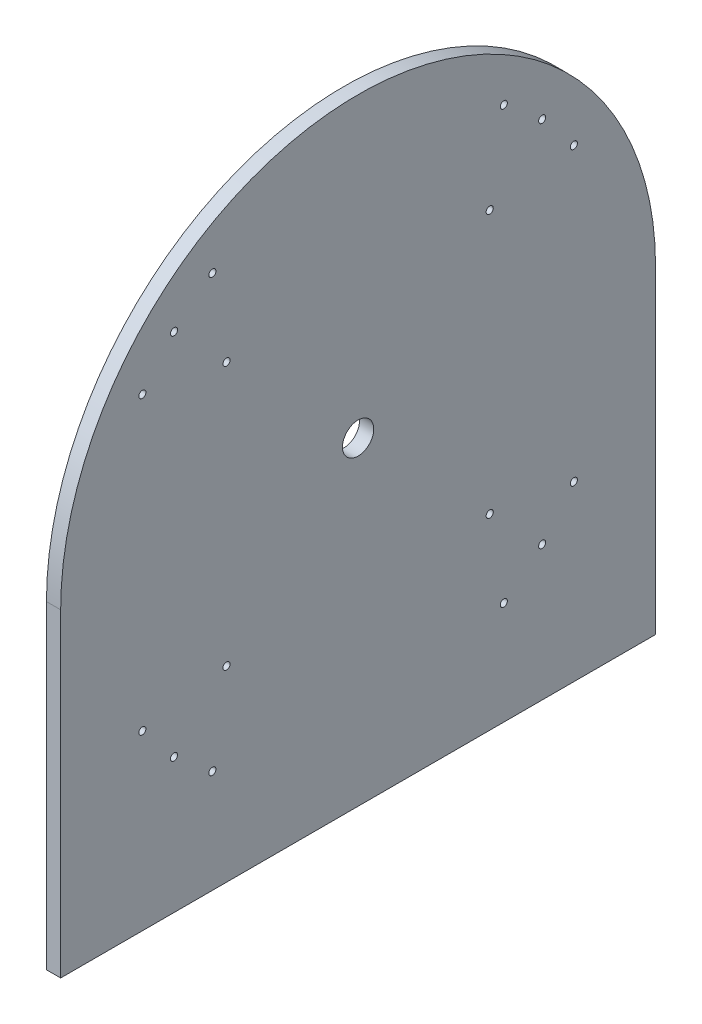
ISO-10303-21;
HEADER;
FILE_DESCRIPTION(('STEP AP214'),'2;1');
FILE_NAME('part.step','',(''),(''),'','','');
FILE_SCHEMA(('AUTOMOTIVE_DESIGN { 1 0 10303 214 1 1 1 1 }'));
ENDSEC;
DATA;
#1=APPLICATION_CONTEXT('core data for automotive mechanical design processes');
#2=APPLICATION_PROTOCOL_DEFINITION('international standard','automotive_design',2000,#1);
#3=PRODUCT_CONTEXT('',#1,'mechanical');
#4=PRODUCT('Part','Part','',(#3));
#5=PRODUCT_RELATED_PRODUCT_CATEGORY('part','',(#4));
#6=PRODUCT_DEFINITION_FORMATION('','',#4);
#7=PRODUCT_DEFINITION_CONTEXT('part definition',#1,'design');
#8=PRODUCT_DEFINITION('design','',#6,#7);
#9=PRODUCT_DEFINITION_SHAPE('','',#8);
#10=(LENGTH_UNIT() NAMED_UNIT(*) SI_UNIT(.MILLI.,.METRE.));
#11=(NAMED_UNIT(*) PLANE_ANGLE_UNIT() SI_UNIT($,.RADIAN.));
#12=(NAMED_UNIT(*) SI_UNIT($,.STERADIAN.) SOLID_ANGLE_UNIT());
#13=UNCERTAINTY_MEASURE_WITH_UNIT(LENGTH_MEASURE(1.E-05),#10,'distance_accuracy_value','');
#14=(GEOMETRIC_REPRESENTATION_CONTEXT(3) GLOBAL_UNCERTAINTY_ASSIGNED_CONTEXT((#13)) GLOBAL_UNIT_ASSIGNED_CONTEXT((#10,
#11,#12)) REPRESENTATION_CONTEXT('',''));
#15=CARTESIAN_POINT('',(0.,0.,0.));
#16=DIRECTION('',(0.,0.,1.));
#17=DIRECTION('',(1.,0.,0.));
#18=AXIS2_PLACEMENT_3D('',#15,#16,#17);
#19=CARTESIAN_POINT('',(10.,0.,0.));
#20=DIRECTION('',(-1.,0.,0.));
#21=DIRECTION('',(0.,0.,1.));
#22=AXIS2_PLACEMENT_3D('',#19,#20,#21);
#23=CYLINDRICAL_SURFACE('',#22,209.31);
#24=CARTESIAN_POINT('',(0.,0.,0.));
#25=DIRECTION('',(1.,0.,0.));
#26=DIRECTION('',(0.,0.,-1.));
#27=AXIS2_PLACEMENT_3D('',#24,#25,#26);
#28=CIRCLE('',#27,209.31);
#29=CARTESIAN_POINT('',(0.,0.,-209.31));
#30=VERTEX_POINT('',#29);
#31=CARTESIAN_POINT('',(0.,0.,209.31));
#32=VERTEX_POINT('',#31);
#33=EDGE_CURVE('E108',#30,#32,#28,.T.);
#34=ORIENTED_EDGE('',*,*,#33,.T.);
#35=DIRECTION('',(-1.,0.,0.));
#36=VECTOR('',#35,1.);
#37=CARTESIAN_POINT('',(10.,0.,209.31));
#38=LINE('',#37,#36);
#39=CARTESIAN_POINT('',(10.,0.,209.31));
#40=VERTEX_POINT('',#39);
#41=EDGE_CURVE('E11',#40,#32,#38,.T.);
#42=ORIENTED_EDGE('',*,*,#41,.F.);
#43=CARTESIAN_POINT('',(10.,0.,0.));
#44=DIRECTION('',(1.,0.,0.));
#45=DIRECTION('',(0.,0.,-1.));
#46=AXIS2_PLACEMENT_3D('',#43,#44,#45);
#47=CIRCLE('',#46,209.31);
#48=CARTESIAN_POINT('',(10.,0.,-209.31));
#49=VERTEX_POINT('',#48);
#50=EDGE_CURVE('E81',#49,#40,#47,.T.);
#51=ORIENTED_EDGE('',*,*,#50,.F.);
#52=DIRECTION('',(-1.,0.,0.));
#53=VECTOR('',#52,1.);
#54=CARTESIAN_POINT('',(10.,0.,-209.31));
#55=LINE('',#54,#53);
#56=EDGE_CURVE('E104',#49,#30,#55,.T.);
#57=ORIENTED_EDGE('',*,*,#56,.T.);
#58=EDGE_LOOP('',(#34,#42,#51,#57));
#59=FACE_BOUND('',#58,.T.);
#60=ADVANCED_FACE('F41',(#59),#23,.T.);
#61=CARTESIAN_POINT('',(10.,0.,209.31));
#62=DIRECTION('',(0.,0.,1.));
#63=DIRECTION('',(0.,-1.,0.));
#64=AXIS2_PLACEMENT_3D('',#61,#62,#63);
#65=PLANE('',#64);
#66=DIRECTION('',(0.,1.,0.));
#67=VECTOR('',#66,1.);
#68=CARTESIAN_POINT('',(0.,0.,209.31));
#69=LINE('',#68,#67);
#70=CARTESIAN_POINT('',(0.,-224.4,209.31));
#71=VERTEX_POINT('',#70);
#72=EDGE_CURVE('E90',#71,#32,#69,.T.);
#73=ORIENTED_EDGE('',*,*,#72,.F.);
#74=DIRECTION('',(-1.,0.,0.));
#75=VECTOR('',#74,1.);
#76=CARTESIAN_POINT('',(10.,-224.4,209.31));
#77=LINE('',#76,#75);
#78=CARTESIAN_POINT('',(10.,-224.4,209.31));
#79=VERTEX_POINT('',#78);
#80=EDGE_CURVE('E50',#79,#71,#77,.T.);
#81=ORIENTED_EDGE('',*,*,#80,.F.);
#82=DIRECTION('',(0.,1.,0.));
#83=VECTOR('',#82,1.);
#84=CARTESIAN_POINT('',(10.,0.,209.31));
#85=LINE('',#84,#83);
#86=EDGE_CURVE('E88',#79,#40,#85,.T.);
#87=ORIENTED_EDGE('',*,*,#86,.T.);
#88=ORIENTED_EDGE('',*,*,#41,.T.);
#89=EDGE_LOOP('',(#73,#81,#87,#88));
#90=FACE_BOUND('',#89,.T.);
#91=ADVANCED_FACE('F87',(#90),#65,.T.);
#92=CARTESIAN_POINT('',(10.,-224.4,0.));
#93=DIRECTION('',(0.,-1.,0.));
#94=DIRECTION('',(0.,0.,-1.));
#95=AXIS2_PLACEMENT_3D('',#92,#93,#94);
#96=PLANE('',#95);
#97=DIRECTION('',(0.,0.,1.));
#98=VECTOR('',#97,1.);
#99=CARTESIAN_POINT('',(0.,-224.4,0.));
#100=LINE('',#99,#98);
#101=CARTESIAN_POINT('',(0.,-224.4,-209.31));
#102=VERTEX_POINT('',#101);
#103=EDGE_CURVE('E115',#102,#71,#100,.T.);
#104=ORIENTED_EDGE('',*,*,#103,.F.);
#105=DIRECTION('',(-1.,0.,0.));
#106=VECTOR('',#105,1.);
#107=CARTESIAN_POINT('',(10.,-224.4,-209.31));
#108=LINE('',#107,#106);
#109=CARTESIAN_POINT('',(10.,-224.4,-209.31));
#110=VERTEX_POINT('',#109);
#111=EDGE_CURVE('E73',#110,#102,#108,.T.);
#112=ORIENTED_EDGE('',*,*,#111,.F.);
#113=DIRECTION('',(0.,0.,1.));
#114=VECTOR('',#113,1.);
#115=CARTESIAN_POINT('',(10.,-224.4,0.));
#116=LINE('',#115,#114);
#117=EDGE_CURVE('E97',#110,#79,#116,.T.);
#118=ORIENTED_EDGE('',*,*,#117,.T.);
#119=ORIENTED_EDGE('',*,*,#80,.T.);
#120=EDGE_LOOP('',(#104,#112,#118,#119));
#121=FACE_BOUND('',#120,.T.);
#122=ADVANCED_FACE('F100',(#121),#96,.T.);
#123=CARTESIAN_POINT('',(10.,0.,-209.31));
#124=DIRECTION('',(0.,0.,1.));
#125=DIRECTION('',(1.,0.,0.));
#126=AXIS2_PLACEMENT_3D('',#123,#124,#125);
#127=PLANE('',#126);
#128=DIRECTION('',(0.,1.,0.));
#129=VECTOR('',#128,1.);
#130=CARTESIAN_POINT('',(0.,0.,-209.31));
#131=LINE('',#130,#129);
#132=EDGE_CURVE('E76',#102,#30,#131,.T.);
#133=ORIENTED_EDGE('',*,*,#132,.T.);
#134=ORIENTED_EDGE('',*,*,#56,.F.);
#135=DIRECTION('',(0.,1.,0.));
#136=VECTOR('',#135,1.);
#137=CARTESIAN_POINT('',(10.,0.,-209.31));
#138=LINE('',#137,#136);
#139=EDGE_CURVE('E58',#110,#49,#138,.T.);
#140=ORIENTED_EDGE('',*,*,#139,.F.);
#141=ORIENTED_EDGE('',*,*,#111,.T.);
#142=EDGE_LOOP('',(#133,#134,#140,#141));
#143=FACE_BOUND('',#142,.T.);
#144=ADVANCED_FACE('F138',(#143),#127,.F.);
#145=CARTESIAN_POINT('',(10.,0.,0.));
#146=DIRECTION('',(1.,0.,0.));
#147=DIRECTION('',(0.,0.,-1.));
#148=AXIS2_PLACEMENT_3D('',#145,#146,#147);
#149=PLANE('',#148);
#150=CARTESIAN_POINT('',(10.,151.806215461655,102.535111289771));
#151=DIRECTION('',(1.,0.,0.));
#152=DIRECTION('',(0.,0.,1.));
#153=AXIS2_PLACEMENT_3D('',#150,#151,#152);
#154=CIRCLE('',#153,2.49999999999999);
#155=CARTESIAN_POINT('',(10.,151.806215461655,105.035111289771));
#156=VERTEX_POINT('',#155);
#157=EDGE_CURVE('E405',#156,#156,#154,.T.);
#158=ORIENTED_EDGE('',*,*,#157,.F.);
#159=EDGE_LOOP('',(#158));
#160=FACE_BOUND('',#159,.T.);
#161=CARTESIAN_POINT('',(10.,151.806215461681,-102.535111289757));
#162=DIRECTION('',(1.,0.,0.));
#163=DIRECTION('',(0.,0.,-1.));
#164=AXIS2_PLACEMENT_3D('',#161,#162,#163);
#165=CIRCLE('',#164,2.5000000000151);
#166=CARTESIAN_POINT('',(10.,151.806215461681,-105.035111289772));
#167=VERTEX_POINT('',#166);
#168=EDGE_CURVE('E397',#167,#167,#165,.T.);
#169=ORIENTED_EDGE('',*,*,#168,.F.);
#170=EDGE_LOOP('',(#169));
#171=FACE_BOUND('',#170,.T.);
#172=CARTESIAN_POINT('',(10.,102.535111289788,-151.806215461655));
#173=DIRECTION('',(1.,0.,0.));
#174=DIRECTION('',(0.,0.,1.));
#175=AXIS2_PLACEMENT_3D('',#172,#173,#174);
#176=CIRCLE('',#175,2.49999999999417);
#177=CARTESIAN_POINT('',(10.,102.535111289788,-149.306215461661));
#178=VERTEX_POINT('',#177);
#179=EDGE_CURVE('E389',#178,#178,#176,.T.);
#180=ORIENTED_EDGE('',*,*,#179,.F.);
#181=EDGE_LOOP('',(#180));
#182=FACE_BOUND('',#181,.T.);
#183=CARTESIAN_POINT('',(10.,-102.535111289742,-151.806215461678));
#184=DIRECTION('',(1.,0.,0.));
#185=DIRECTION('',(0.,0.,-1.));
#186=AXIS2_PLACEMENT_3D('',#183,#184,#185);
#187=CIRCLE('',#186,2.50000000001716);
#188=CARTESIAN_POINT('',(10.,-102.535111289742,-154.306215461696));
#189=VERTEX_POINT('',#188);
#190=EDGE_CURVE('E380',#189,#189,#187,.T.);
#191=ORIENTED_EDGE('',*,*,#190,.F.);
#192=EDGE_LOOP('',(#191));
#193=FACE_BOUND('',#192,.T.);
#194=CARTESIAN_POINT('',(10.,-151.80621546164,-102.535111289785));
#195=DIRECTION('',(1.,0.,0.));
#196=DIRECTION('',(0.,0.,1.));
#197=AXIS2_PLACEMENT_3D('',#194,#195,#196);
#198=CIRCLE('',#197,2.4999999999807);
#199=CARTESIAN_POINT('',(10.,-151.80621546164,-100.035111289804));
#200=VERTEX_POINT('',#199);
#201=EDGE_CURVE('E427',#200,#200,#198,.T.);
#202=ORIENTED_EDGE('',*,*,#201,.F.);
#203=EDGE_LOOP('',(#202));
#204=FACE_BOUND('',#203,.T.);
#205=CARTESIAN_POINT('',(10.,-151.806215461664,102.535111289745));
#206=DIRECTION('',(1.,0.,0.));
#207=DIRECTION('',(0.,0.,-1.));
#208=AXIS2_PLACEMENT_3D('',#205,#206,#207);
#209=CIRCLE('',#208,2.50000000000312);
#210=CARTESIAN_POINT('',(10.,-151.806215461664,100.035111289742));
#211=VERTEX_POINT('',#210);
#212=EDGE_CURVE('E419',#211,#211,#209,.T.);
#213=ORIENTED_EDGE('',*,*,#212,.F.);
#214=EDGE_LOOP('',(#213));
#215=FACE_BOUND('',#214,.T.);
#216=CARTESIAN_POINT('',(10.,-102.53511128977,151.806215461643));
#217=DIRECTION('',(1.,0.,0.));
#218=DIRECTION('',(0.,0.,1.));
#219=AXIS2_PLACEMENT_3D('',#216,#217,#218);
#220=CIRCLE('',#219,2.49999999998698);
#221=CARTESIAN_POINT('',(10.,-102.53511128977,154.30621546163));
#222=VERTEX_POINT('',#221);
#223=EDGE_CURVE('E411',#222,#222,#220,.T.);
#224=ORIENTED_EDGE('',*,*,#223,.F.);
#225=EDGE_LOOP('',(#224));
#226=FACE_BOUND('',#225,.T.);
#227=CARTESIAN_POINT('',(10.,102.535111289759,151.806215461667));
#228=DIRECTION('',(1.,0.,0.));
#229=DIRECTION('',(0.,0.,-1.));
#230=AXIS2_PLACEMENT_3D('',#227,#228,#229);
#231=CIRCLE('',#230,2.5);
#232=CARTESIAN_POINT('',(10.,102.535111289759,149.306215461667));
#233=VERTEX_POINT('',#232);
#234=EDGE_CURVE('E372',#233,#233,#231,.T.);
#235=ORIENTED_EDGE('',*,*,#234,.F.);
#236=EDGE_LOOP('',(#235));
#237=FACE_BOUND('',#236,.T.);
#238=CARTESIAN_POINT('',(10.,0.,0.));
#239=DIRECTION('',(1.,0.,0.));
#240=DIRECTION('',(0.,0.,-1.));
#241=AXIS2_PLACEMENT_3D('',#238,#239,#240);
#242=CIRCLE('',#241,11.);
#243=CARTESIAN_POINT('',(10.,0.,-11.));
#244=VERTEX_POINT('',#243);
#245=EDGE_CURVE('E364',#244,#244,#242,.T.);
#246=ORIENTED_EDGE('',*,*,#245,.F.);
#247=EDGE_LOOP('',(#246));
#248=FACE_BOUND('',#247,.T.);
#249=CARTESIAN_POINT('',(10.,-92.6097751320016,-92.6097751320129));
#250=DIRECTION('',(1.,0.,0.));
#251=DIRECTION('',(0.,0.,-1.));
#252=AXIS2_PLACEMENT_3D('',#249,#250,#251);
#253=CIRCLE('',#252,2.49999999999715);
#254=CARTESIAN_POINT('',(10.,-92.6097751320016,-95.1097751320101));
#255=VERTEX_POINT('',#254);
#256=EDGE_CURVE('E318',#255,#255,#253,.T.);
#257=ORIENTED_EDGE('',*,*,#256,.F.);
#258=EDGE_LOOP('',(#257));
#259=FACE_BOUND('',#258,.T.);
#260=CARTESIAN_POINT('',(10.,92.6097751320026,-92.6097751320016));
#261=DIRECTION('',(1.,0.,0.));
#262=DIRECTION('',(0.,0.,-1.));
#263=AXIS2_PLACEMENT_3D('',#260,#261,#262);
#264=CIRCLE('',#263,2.5);
#265=CARTESIAN_POINT('',(10.,92.6097751320026,-95.1097751320016));
#266=VERTEX_POINT('',#265);
#267=EDGE_CURVE('E327',#266,#266,#264,.T.);
#268=ORIENTED_EDGE('',*,*,#267,.F.);
#269=EDGE_LOOP('',(#268));
#270=FACE_BOUND('',#269,.T.);
#271=CARTESIAN_POINT('',(10.,129.534891245564,-129.534891245563));
#272=DIRECTION('',(1.,0.,0.));
#273=DIRECTION('',(0.,0.,-1.));
#274=AXIS2_PLACEMENT_3D('',#271,#272,#273);
#275=CIRCLE('',#274,2.5);
#276=CARTESIAN_POINT('',(10.,129.534891245564,-132.034891245563));
#277=VERTEX_POINT('',#276);
#278=EDGE_CURVE('E306',#277,#277,#275,.T.);
#279=ORIENTED_EDGE('',*,*,#278,.F.);
#280=EDGE_LOOP('',(#279));
#281=FACE_BOUND('',#280,.T.);
#282=CARTESIAN_POINT('',(10.,129.534891245553,129.534891245564));
#283=DIRECTION('',(1.,0.,0.));
#284=DIRECTION('',(0.,0.,-1.));
#285=AXIS2_PLACEMENT_3D('',#282,#283,#284);
#286=CIRCLE('',#285,2.50000000001075);
#287=CARTESIAN_POINT('',(10.,129.534891245553,127.034891245554));
#288=VERTEX_POINT('',#287);
#289=EDGE_CURVE('E298',#288,#288,#286,.T.);
#290=ORIENTED_EDGE('',*,*,#289,.F.);
#291=EDGE_LOOP('',(#290));
#292=FACE_BOUND('',#291,.T.);
#293=CARTESIAN_POINT('',(10.,92.6097751319913,92.6097751320027));
#294=DIRECTION('',(1.,0.,0.));
#295=DIRECTION('',(0.,0.,-1.));
#296=AXIS2_PLACEMENT_3D('',#293,#294,#295);
#297=CIRCLE('',#296,2.50000000001048);
#298=CARTESIAN_POINT('',(10.,92.6097751319913,90.1097751319922));
#299=VERTEX_POINT('',#298);
#300=EDGE_CURVE('E308',#299,#299,#297,.T.);
#301=ORIENTED_EDGE('',*,*,#300,.F.);
#302=EDGE_LOOP('',(#301));
#303=FACE_BOUND('',#302,.T.);
#304=CARTESIAN_POINT('',(10.,-129.534891245575,129.534891245553));
#305=DIRECTION('',(1.,0.,0.));
#306=DIRECTION('',(0.,0.,-1.));
#307=AXIS2_PLACEMENT_3D('',#304,#305,#306);
#308=CIRCLE('',#307,2.50000000000739);
#309=CARTESIAN_POINT('',(10.,-129.534891245575,127.034891245545));
#310=VERTEX_POINT('',#309);
#311=EDGE_CURVE('E353',#310,#310,#308,.T.);
#312=ORIENTED_EDGE('',*,*,#311,.F.);
#313=EDGE_LOOP('',(#312));
#314=FACE_BOUND('',#313,.T.);
#315=CARTESIAN_POINT('',(10.,-129.534891245563,-129.534891245575));
#316=DIRECTION('',(1.,0.,0.));
#317=DIRECTION('',(0.,0.,-1.));
#318=AXIS2_PLACEMENT_3D('',#315,#316,#317);
#319=CIRCLE('',#318,2.49999999999725);
#320=CARTESIAN_POINT('',(10.,-129.534891245563,-132.034891245572));
#321=VERTEX_POINT('',#320);
#322=EDGE_CURVE('E344',#321,#321,#319,.T.);
#323=ORIENTED_EDGE('',*,*,#322,.F.);
#324=EDGE_LOOP('',(#323));
#325=FACE_BOUND('',#324,.T.);
#326=CARTESIAN_POINT('',(10.,-92.609775132013,92.6097751319913));
#327=DIRECTION('',(1.,0.,0.));
#328=DIRECTION('',(0.,0.,-1.));
#329=AXIS2_PLACEMENT_3D('',#326,#327,#328);
#330=CIRCLE('',#329,2.5000000000072);
#331=CARTESIAN_POINT('',(10.,-92.609775132013,90.1097751319841));
#332=VERTEX_POINT('',#331);
#333=EDGE_CURVE('E315',#332,#332,#330,.T.);
#334=ORIENTED_EDGE('',*,*,#333,.F.);
#335=EDGE_LOOP('',(#334));
#336=FACE_BOUND('',#335,.T.);
#337=ORIENTED_EDGE('',*,*,#50,.T.);
#338=ORIENTED_EDGE('',*,*,#86,.F.);
#339=ORIENTED_EDGE('',*,*,#117,.F.);
#340=ORIENTED_EDGE('',*,*,#139,.T.);
#341=EDGE_LOOP('',(#337,#338,#339,#340));
#342=FACE_BOUND('',#341,.T.);
#343=ADVANCED_FACE('F96',(#160,#171,#182,#193,#204,#215,#226,#237,#248,#259,#270,#281,#292,#303,
#314,#325,#336,#342),#149,.T.);
#344=CARTESIAN_POINT('',(0.,0.,0.));
#345=DIRECTION('',(1.,0.,0.));
#346=DIRECTION('',(0.,0.,-1.));
#347=AXIS2_PLACEMENT_3D('',#344,#345,#346);
#348=PLANE('',#347);
#349=CARTESIAN_POINT('',(0.,151.806215461655,102.535111289771));
#350=DIRECTION('',(1.,0.,0.));
#351=DIRECTION('',(0.,0.,1.));
#352=AXIS2_PLACEMENT_3D('',#349,#350,#351);
#353=CIRCLE('',#352,2.49999999999999);
#354=CARTESIAN_POINT('',(0.,151.806215461655,105.035111289771));
#355=VERTEX_POINT('',#354);
#356=EDGE_CURVE('E376',#355,#355,#353,.T.);
#357=ORIENTED_EDGE('',*,*,#356,.T.);
#358=EDGE_LOOP('',(#357));
#359=FACE_BOUND('',#358,.T.);
#360=CARTESIAN_POINT('',(0.,151.806215461681,-102.535111289757));
#361=DIRECTION('',(1.,0.,0.));
#362=DIRECTION('',(0.,0.,-1.));
#363=AXIS2_PLACEMENT_3D('',#360,#361,#362);
#364=CIRCLE('',#363,2.5000000000151);
#365=CARTESIAN_POINT('',(0.,151.806215461681,-105.035111289772));
#366=VERTEX_POINT('',#365);
#367=EDGE_CURVE('E401',#366,#366,#364,.T.);
#368=ORIENTED_EDGE('',*,*,#367,.T.);
#369=EDGE_LOOP('',(#368));
#370=FACE_BOUND('',#369,.T.);
#371=CARTESIAN_POINT('',(0.,102.535111289788,-151.806215461655));
#372=DIRECTION('',(1.,0.,0.));
#373=DIRECTION('',(0.,0.,1.));
#374=AXIS2_PLACEMENT_3D('',#371,#372,#373);
#375=CIRCLE('',#374,2.49999999999417);
#376=CARTESIAN_POINT('',(0.,102.535111289788,-149.306215461661));
#377=VERTEX_POINT('',#376);
#378=EDGE_CURVE('E393',#377,#377,#375,.T.);
#379=ORIENTED_EDGE('',*,*,#378,.T.);
#380=EDGE_LOOP('',(#379));
#381=FACE_BOUND('',#380,.T.);
#382=CARTESIAN_POINT('',(0.,-102.535111289742,-151.806215461678));
#383=DIRECTION('',(1.,0.,0.));
#384=DIRECTION('',(0.,0.,-1.));
#385=AXIS2_PLACEMENT_3D('',#382,#383,#384);
#386=CIRCLE('',#385,2.50000000001716);
#387=CARTESIAN_POINT('',(0.,-102.535111289742,-154.306215461696));
#388=VERTEX_POINT('',#387);
#389=EDGE_CURVE('E384',#388,#388,#386,.T.);
#390=ORIENTED_EDGE('',*,*,#389,.T.);
#391=EDGE_LOOP('',(#390));
#392=FACE_BOUND('',#391,.T.);
#393=CARTESIAN_POINT('',(0.,-151.80621546164,-102.535111289785));
#394=DIRECTION('',(1.,0.,0.));
#395=DIRECTION('',(0.,0.,1.));
#396=AXIS2_PLACEMENT_3D('',#393,#394,#395);
#397=CIRCLE('',#396,2.4999999999807);
#398=CARTESIAN_POINT('',(0.,-151.80621546164,-100.035111289804));
#399=VERTEX_POINT('',#398);
#400=EDGE_CURVE('E385',#399,#399,#397,.T.);
#401=ORIENTED_EDGE('',*,*,#400,.T.);
#402=EDGE_LOOP('',(#401));
#403=FACE_BOUND('',#402,.T.);
#404=CARTESIAN_POINT('',(0.,-151.806215461664,102.535111289745));
#405=DIRECTION('',(1.,0.,0.));
#406=DIRECTION('',(0.,0.,-1.));
#407=AXIS2_PLACEMENT_3D('',#404,#405,#406);
#408=CIRCLE('',#407,2.50000000000312);
#409=CARTESIAN_POINT('',(0.,-151.806215461664,100.035111289742));
#410=VERTEX_POINT('',#409);
#411=EDGE_CURVE('E423',#410,#410,#408,.T.);
#412=ORIENTED_EDGE('',*,*,#411,.T.);
#413=EDGE_LOOP('',(#412));
#414=FACE_BOUND('',#413,.T.);
#415=CARTESIAN_POINT('',(0.,-102.53511128977,151.806215461643));
#416=DIRECTION('',(1.,0.,0.));
#417=DIRECTION('',(0.,0.,1.));
#418=AXIS2_PLACEMENT_3D('',#415,#416,#417);
#419=CIRCLE('',#418,2.49999999998698);
#420=CARTESIAN_POINT('',(0.,-102.53511128977,154.30621546163));
#421=VERTEX_POINT('',#420);
#422=EDGE_CURVE('E415',#421,#421,#419,.T.);
#423=ORIENTED_EDGE('',*,*,#422,.T.);
#424=EDGE_LOOP('',(#423));
#425=FACE_BOUND('',#424,.T.);
#426=CARTESIAN_POINT('',(0.,102.535111289759,151.806215461667));
#427=DIRECTION('',(1.,0.,0.));
#428=DIRECTION('',(0.,0.,-1.));
#429=AXIS2_PLACEMENT_3D('',#426,#427,#428);
#430=CIRCLE('',#429,2.5);
#431=CARTESIAN_POINT('',(0.,102.535111289759,149.306215461667));
#432=VERTEX_POINT('',#431);
#433=EDGE_CURVE('E368',#432,#432,#430,.T.);
#434=ORIENTED_EDGE('',*,*,#433,.T.);
#435=EDGE_LOOP('',(#434));
#436=FACE_BOUND('',#435,.T.);
#437=CARTESIAN_POINT('',(0.,0.,0.));
#438=DIRECTION('',(1.,0.,0.));
#439=DIRECTION('',(0.,0.,-1.));
#440=AXIS2_PLACEMENT_3D('',#437,#438,#439);
#441=CIRCLE('',#440,11.);
#442=CARTESIAN_POINT('',(0.,0.,-11.));
#443=VERTEX_POINT('',#442);
#444=EDGE_CURVE('E345',#443,#443,#441,.T.);
#445=ORIENTED_EDGE('',*,*,#444,.T.);
#446=EDGE_LOOP('',(#445));
#447=FACE_BOUND('',#446,.T.);
#448=CARTESIAN_POINT('',(0.,-92.6097751320016,-92.6097751320129));
#449=DIRECTION('',(1.,0.,0.));
#450=DIRECTION('',(0.,0.,-1.));
#451=AXIS2_PLACEMENT_3D('',#448,#449,#450);
#452=CIRCLE('',#451,2.49999999999715);
#453=CARTESIAN_POINT('',(0.,-92.6097751320016,-95.1097751320101));
#454=VERTEX_POINT('',#453);
#455=EDGE_CURVE('E323',#454,#454,#452,.T.);
#456=ORIENTED_EDGE('',*,*,#455,.T.);
#457=EDGE_LOOP('',(#456));
#458=FACE_BOUND('',#457,.T.);
#459=CARTESIAN_POINT('',(0.,92.6097751320026,-92.6097751320016));
#460=DIRECTION('',(1.,0.,0.));
#461=DIRECTION('',(0.,0.,-1.));
#462=AXIS2_PLACEMENT_3D('',#459,#460,#461);
#463=CIRCLE('',#462,2.5);
#464=CARTESIAN_POINT('',(0.,92.6097751320026,-95.1097751320016));
#465=VERTEX_POINT('',#464);
#466=EDGE_CURVE('E331',#465,#465,#463,.T.);
#467=ORIENTED_EDGE('',*,*,#466,.T.);
#468=EDGE_LOOP('',(#467));
#469=FACE_BOUND('',#468,.T.);
#470=CARTESIAN_POINT('',(0.,129.534891245564,-129.534891245563));
#471=DIRECTION('',(1.,0.,0.));
#472=DIRECTION('',(0.,0.,-1.));
#473=AXIS2_PLACEMENT_3D('',#470,#471,#472);
#474=CIRCLE('',#473,2.5);
#475=CARTESIAN_POINT('',(0.,129.534891245564,-132.034891245563));
#476=VERTEX_POINT('',#475);
#477=EDGE_CURVE('E301',#476,#476,#474,.T.);
#478=ORIENTED_EDGE('',*,*,#477,.T.);
#479=EDGE_LOOP('',(#478));
#480=FACE_BOUND('',#479,.T.);
#481=CARTESIAN_POINT('',(0.,129.534891245553,129.534891245564));
#482=DIRECTION('',(1.,0.,0.));
#483=DIRECTION('',(0.,0.,-1.));
#484=AXIS2_PLACEMENT_3D('',#481,#482,#483);
#485=CIRCLE('',#484,2.50000000001075);
#486=CARTESIAN_POINT('',(0.,129.534891245553,127.034891245554));
#487=VERTEX_POINT('',#486);
#488=EDGE_CURVE('E295',#487,#487,#485,.T.);
#489=ORIENTED_EDGE('',*,*,#488,.T.);
#490=EDGE_LOOP('',(#489));
#491=FACE_BOUND('',#490,.T.);
#492=CARTESIAN_POINT('',(0.,92.6097751319913,92.6097751320027));
#493=DIRECTION('',(1.,0.,0.));
#494=DIRECTION('',(0.,0.,-1.));
#495=AXIS2_PLACEMENT_3D('',#492,#493,#494);
#496=CIRCLE('',#495,2.50000000001048);
#497=CARTESIAN_POINT('',(0.,92.6097751319913,90.1097751319922));
#498=VERTEX_POINT('',#497);
#499=EDGE_CURVE('E357',#498,#498,#496,.T.);
#500=ORIENTED_EDGE('',*,*,#499,.T.);
#501=EDGE_LOOP('',(#500));
#502=FACE_BOUND('',#501,.T.);
#503=CARTESIAN_POINT('',(0.,-129.534891245575,129.534891245553));
#504=DIRECTION('',(1.,0.,0.));
#505=DIRECTION('',(0.,0.,-1.));
#506=AXIS2_PLACEMENT_3D('',#503,#504,#505);
#507=CIRCLE('',#506,2.50000000000739);
#508=CARTESIAN_POINT('',(0.,-129.534891245575,127.034891245545));
#509=VERTEX_POINT('',#508);
#510=EDGE_CURVE('E349',#509,#509,#507,.T.);
#511=ORIENTED_EDGE('',*,*,#510,.T.);
#512=EDGE_LOOP('',(#511));
#513=FACE_BOUND('',#512,.T.);
#514=CARTESIAN_POINT('',(0.,-129.534891245563,-129.534891245575));
#515=DIRECTION('',(1.,0.,0.));
#516=DIRECTION('',(0.,0.,-1.));
#517=AXIS2_PLACEMENT_3D('',#514,#515,#516);
#518=CIRCLE('',#517,2.49999999999725);
#519=CARTESIAN_POINT('',(0.,-129.534891245563,-132.034891245572));
#520=VERTEX_POINT('',#519);
#521=EDGE_CURVE('E340',#520,#520,#518,.T.);
#522=ORIENTED_EDGE('',*,*,#521,.T.);
#523=EDGE_LOOP('',(#522));
#524=FACE_BOUND('',#523,.T.);
#525=CARTESIAN_POINT('',(0.,-92.609775132013,92.6097751319913));
#526=DIRECTION('',(1.,0.,0.));
#527=DIRECTION('',(0.,0.,-1.));
#528=AXIS2_PLACEMENT_3D('',#525,#526,#527);
#529=CIRCLE('',#528,2.5000000000072);
#530=CARTESIAN_POINT('',(0.,-92.609775132013,90.1097751319841));
#531=VERTEX_POINT('',#530);
#532=EDGE_CURVE('E112',#531,#531,#529,.T.);
#533=ORIENTED_EDGE('',*,*,#532,.T.);
#534=EDGE_LOOP('',(#533));
#535=FACE_BOUND('',#534,.T.);
#536=ORIENTED_EDGE('',*,*,#33,.F.);
#537=ORIENTED_EDGE('',*,*,#132,.F.);
#538=ORIENTED_EDGE('',*,*,#103,.T.);
#539=ORIENTED_EDGE('',*,*,#72,.T.);
#540=EDGE_LOOP('',(#536,#537,#538,#539));
#541=FACE_BOUND('',#540,.T.);
#542=ADVANCED_FACE('F126',(#359,#370,#381,#392,#403,#414,#425,#436,#447,#458,#469,#480,#491,
#502,#513,#524,#535,#541),#348,.F.);
#543=CARTESIAN_POINT('',(0.,-92.609775132013,92.6097751319913));
#544=DIRECTION('',(1.,0.,0.));
#545=DIRECTION('',(0.,0.,-1.));
#546=AXIS2_PLACEMENT_3D('',#543,#544,#545);
#547=CYLINDRICAL_SURFACE('',#546,2.5000000000072);
#548=ORIENTED_EDGE('',*,*,#532,.F.);
#549=EDGE_LOOP('',(#548));
#550=FACE_BOUND('',#549,.T.);
#551=ORIENTED_EDGE('',*,*,#333,.T.);
#552=EDGE_LOOP('',(#551));
#553=FACE_BOUND('',#552,.T.);
#554=ADVANCED_FACE('F128',(#550,#553),#547,.F.);
#555=CARTESIAN_POINT('',(0.,-129.534891245563,-129.534891245575));
#556=DIRECTION('',(1.,0.,0.));
#557=DIRECTION('',(0.,0.,-1.));
#558=AXIS2_PLACEMENT_3D('',#555,#556,#557);
#559=CYLINDRICAL_SURFACE('',#558,2.49999999999725);
#560=ORIENTED_EDGE('',*,*,#521,.F.);
#561=EDGE_LOOP('',(#560));
#562=FACE_BOUND('',#561,.T.);
#563=ORIENTED_EDGE('',*,*,#322,.T.);
#564=EDGE_LOOP('',(#563));
#565=FACE_BOUND('',#564,.T.);
#566=ADVANCED_FACE('F135',(#562,#565),#559,.F.);
#567=CARTESIAN_POINT('',(0.,-129.534891245575,129.534891245553));
#568=DIRECTION('',(1.,0.,0.));
#569=DIRECTION('',(0.,0.,-1.));
#570=AXIS2_PLACEMENT_3D('',#567,#568,#569);
#571=CYLINDRICAL_SURFACE('',#570,2.50000000000739);
#572=ORIENTED_EDGE('',*,*,#510,.F.);
#573=EDGE_LOOP('',(#572));
#574=FACE_BOUND('',#573,.T.);
#575=ORIENTED_EDGE('',*,*,#311,.T.);
#576=EDGE_LOOP('',(#575));
#577=FACE_BOUND('',#576,.T.);
#578=ADVANCED_FACE('F269',(#574,#577),#571,.F.);
#579=CARTESIAN_POINT('',(0.,92.6097751319913,92.6097751320027));
#580=DIRECTION('',(1.,0.,0.));
#581=DIRECTION('',(0.,0.,-1.));
#582=AXIS2_PLACEMENT_3D('',#579,#580,#581);
#583=CYLINDRICAL_SURFACE('',#582,2.50000000001048);
#584=ORIENTED_EDGE('',*,*,#499,.F.);
#585=EDGE_LOOP('',(#584));
#586=FACE_BOUND('',#585,.T.);
#587=ORIENTED_EDGE('',*,*,#300,.T.);
#588=EDGE_LOOP('',(#587));
#589=FACE_BOUND('',#588,.T.);
#590=ADVANCED_FACE('F265',(#586,#589),#583,.F.);
#591=CARTESIAN_POINT('',(0.,129.534891245553,129.534891245564));
#592=DIRECTION('',(1.,0.,0.));
#593=DIRECTION('',(0.,0.,-1.));
#594=AXIS2_PLACEMENT_3D('',#591,#592,#593);
#595=CYLINDRICAL_SURFACE('',#594,2.50000000001075);
#596=ORIENTED_EDGE('',*,*,#488,.F.);
#597=EDGE_LOOP('',(#596));
#598=FACE_BOUND('',#597,.T.);
#599=ORIENTED_EDGE('',*,*,#289,.T.);
#600=EDGE_LOOP('',(#599));
#601=FACE_BOUND('',#600,.T.);
#602=ADVANCED_FACE('F268',(#598,#601),#595,.F.);
#603=CARTESIAN_POINT('',(0.,129.534891245564,-129.534891245563));
#604=DIRECTION('',(1.,0.,0.));
#605=DIRECTION('',(0.,0.,-1.));
#606=AXIS2_PLACEMENT_3D('',#603,#604,#605);
#607=CYLINDRICAL_SURFACE('',#606,2.5);
#608=ORIENTED_EDGE('',*,*,#477,.F.);
#609=EDGE_LOOP('',(#608));
#610=FACE_BOUND('',#609,.T.);
#611=ORIENTED_EDGE('',*,*,#278,.T.);
#612=EDGE_LOOP('',(#611));
#613=FACE_BOUND('',#612,.T.);
#614=ADVANCED_FACE('F283',(#610,#613),#607,.F.);
#615=CARTESIAN_POINT('',(0.,92.6097751320026,-92.6097751320016));
#616=DIRECTION('',(1.,0.,0.));
#617=DIRECTION('',(0.,0.,-1.));
#618=AXIS2_PLACEMENT_3D('',#615,#616,#617);
#619=CYLINDRICAL_SURFACE('',#618,2.5);
#620=ORIENTED_EDGE('',*,*,#466,.F.);
#621=EDGE_LOOP('',(#620));
#622=FACE_BOUND('',#621,.T.);
#623=ORIENTED_EDGE('',*,*,#267,.T.);
#624=EDGE_LOOP('',(#623));
#625=FACE_BOUND('',#624,.T.);
#626=ADVANCED_FACE('F279',(#622,#625),#619,.F.);
#627=CARTESIAN_POINT('',(0.,-92.6097751320016,-92.6097751320129));
#628=DIRECTION('',(1.,0.,0.));
#629=DIRECTION('',(0.,0.,-1.));
#630=AXIS2_PLACEMENT_3D('',#627,#628,#629);
#631=CYLINDRICAL_SURFACE('',#630,2.49999999999715);
#632=ORIENTED_EDGE('',*,*,#455,.F.);
#633=EDGE_LOOP('',(#632));
#634=FACE_BOUND('',#633,.T.);
#635=ORIENTED_EDGE('',*,*,#256,.T.);
#636=EDGE_LOOP('',(#635));
#637=FACE_BOUND('',#636,.T.);
#638=ADVANCED_FACE('F263',(#634,#637),#631,.F.);
#639=CARTESIAN_POINT('',(0.,0.,0.));
#640=DIRECTION('',(1.,0.,0.));
#641=DIRECTION('',(0.,0.,-1.));
#642=AXIS2_PLACEMENT_3D('',#639,#640,#641);
#643=CYLINDRICAL_SURFACE('',#642,11.);
#644=ORIENTED_EDGE('',*,*,#444,.F.);
#645=EDGE_LOOP('',(#644));
#646=FACE_BOUND('',#645,.T.);
#647=ORIENTED_EDGE('',*,*,#245,.T.);
#648=EDGE_LOOP('',(#647));
#649=FACE_BOUND('',#648,.T.);
#650=ADVANCED_FACE('F169',(#646,#649),#643,.F.);
#651=CARTESIAN_POINT('',(0.,102.535111289759,151.806215461667));
#652=DIRECTION('',(1.,0.,0.));
#653=DIRECTION('',(0.,0.,-1.));
#654=AXIS2_PLACEMENT_3D('',#651,#652,#653);
#655=CYLINDRICAL_SURFACE('',#654,2.5);
#656=ORIENTED_EDGE('',*,*,#433,.F.);
#657=EDGE_LOOP('',(#656));
#658=FACE_BOUND('',#657,.T.);
#659=ORIENTED_EDGE('',*,*,#234,.T.);
#660=EDGE_LOOP('',(#659));
#661=FACE_BOUND('',#660,.T.);
#662=ADVANCED_FACE('F180',(#658,#661),#655,.F.);
#663=CARTESIAN_POINT('',(0.,-102.53511128977,151.806215461643));
#664=DIRECTION('',(1.,0.,0.));
#665=DIRECTION('',(0.,0.,-1.));
#666=AXIS2_PLACEMENT_3D('',#663,#664,#665);
#667=CYLINDRICAL_SURFACE('',#666,2.49999999998698);
#668=ORIENTED_EDGE('',*,*,#422,.F.);
#669=EDGE_LOOP('',(#668));
#670=FACE_BOUND('',#669,.T.);
#671=ORIENTED_EDGE('',*,*,#223,.T.);
#672=EDGE_LOOP('',(#671));
#673=FACE_BOUND('',#672,.T.);
#674=ADVANCED_FACE('F185',(#670,#673),#667,.F.);
#675=CARTESIAN_POINT('',(0.,-151.806215461664,102.535111289745));
#676=DIRECTION('',(1.,0.,0.));
#677=DIRECTION('',(0.,0.,-1.));
#678=AXIS2_PLACEMENT_3D('',#675,#676,#677);
#679=CYLINDRICAL_SURFACE('',#678,2.50000000000312);
#680=ORIENTED_EDGE('',*,*,#411,.F.);
#681=EDGE_LOOP('',(#680));
#682=FACE_BOUND('',#681,.T.);
#683=ORIENTED_EDGE('',*,*,#212,.T.);
#684=EDGE_LOOP('',(#683));
#685=FACE_BOUND('',#684,.T.);
#686=ADVANCED_FACE('F195',(#682,#685),#679,.F.);
#687=CARTESIAN_POINT('',(0.,-151.80621546164,-102.535111289785));
#688=DIRECTION('',(1.,0.,0.));
#689=DIRECTION('',(0.,0.,-1.));
#690=AXIS2_PLACEMENT_3D('',#687,#688,#689);
#691=CYLINDRICAL_SURFACE('',#690,2.4999999999807);
#692=ORIENTED_EDGE('',*,*,#400,.F.);
#693=EDGE_LOOP('',(#692));
#694=FACE_BOUND('',#693,.T.);
#695=ORIENTED_EDGE('',*,*,#201,.T.);
#696=EDGE_LOOP('',(#695));
#697=FACE_BOUND('',#696,.T.);
#698=ADVANCED_FACE('F205',(#694,#697),#691,.F.);
#699=CARTESIAN_POINT('',(0.,-102.535111289742,-151.806215461678));
#700=DIRECTION('',(1.,0.,0.));
#701=DIRECTION('',(0.,0.,-1.));
#702=AXIS2_PLACEMENT_3D('',#699,#700,#701);
#703=CYLINDRICAL_SURFACE('',#702,2.50000000001716);
#704=ORIENTED_EDGE('',*,*,#389,.F.);
#705=EDGE_LOOP('',(#704));
#706=FACE_BOUND('',#705,.T.);
#707=ORIENTED_EDGE('',*,*,#190,.T.);
#708=EDGE_LOOP('',(#707));
#709=FACE_BOUND('',#708,.T.);
#710=ADVANCED_FACE('F215',(#706,#709),#703,.F.);
#711=CARTESIAN_POINT('',(0.,102.535111289788,-151.806215461655));
#712=DIRECTION('',(1.,0.,0.));
#713=DIRECTION('',(0.,0.,-1.));
#714=AXIS2_PLACEMENT_3D('',#711,#712,#713);
#715=CYLINDRICAL_SURFACE('',#714,2.49999999999417);
#716=ORIENTED_EDGE('',*,*,#378,.F.);
#717=EDGE_LOOP('',(#716));
#718=FACE_BOUND('',#717,.T.);
#719=ORIENTED_EDGE('',*,*,#179,.T.);
#720=EDGE_LOOP('',(#719));
#721=FACE_BOUND('',#720,.T.);
#722=ADVANCED_FACE('F225',(#718,#721),#715,.F.);
#723=CARTESIAN_POINT('',(0.,151.806215461681,-102.535111289757));
#724=DIRECTION('',(1.,0.,0.));
#725=DIRECTION('',(0.,0.,-1.));
#726=AXIS2_PLACEMENT_3D('',#723,#724,#725);
#727=CYLINDRICAL_SURFACE('',#726,2.5000000000151);
#728=ORIENTED_EDGE('',*,*,#367,.F.);
#729=EDGE_LOOP('',(#728));
#730=FACE_BOUND('',#729,.T.);
#731=ORIENTED_EDGE('',*,*,#168,.T.);
#732=EDGE_LOOP('',(#731));
#733=FACE_BOUND('',#732,.T.);
#734=ADVANCED_FACE('F235',(#730,#733),#727,.F.);
#735=CARTESIAN_POINT('',(0.,151.806215461655,102.535111289771));
#736=DIRECTION('',(1.,0.,0.));
#737=DIRECTION('',(0.,0.,-1.));
#738=AXIS2_PLACEMENT_3D('',#735,#736,#737);
#739=CYLINDRICAL_SURFACE('',#738,2.49999999999999);
#740=ORIENTED_EDGE('',*,*,#356,.F.);
#741=EDGE_LOOP('',(#740));
#742=FACE_BOUND('',#741,.T.);
#743=ORIENTED_EDGE('',*,*,#157,.T.);
#744=EDGE_LOOP('',(#743));
#745=FACE_BOUND('',#744,.T.);
#746=ADVANCED_FACE('F245',(#742,#745),#739,.F.);
#747=CLOSED_SHELL('',(#60,#91,#122,#144,#343,#542,#554,#566,#578,#590,#602,#614,#626,#638,#650,
#662,#674,#686,#698,#710,#722,#734,#746));
#748=MANIFOLD_SOLID_BREP('B2',#747);
#749=ADVANCED_BREP_SHAPE_REPRESENTATION('',(#18,#748),#14);
#750=SHAPE_DEFINITION_REPRESENTATION(#9,#749);
ENDSEC;
END-ISO-10303-21;
